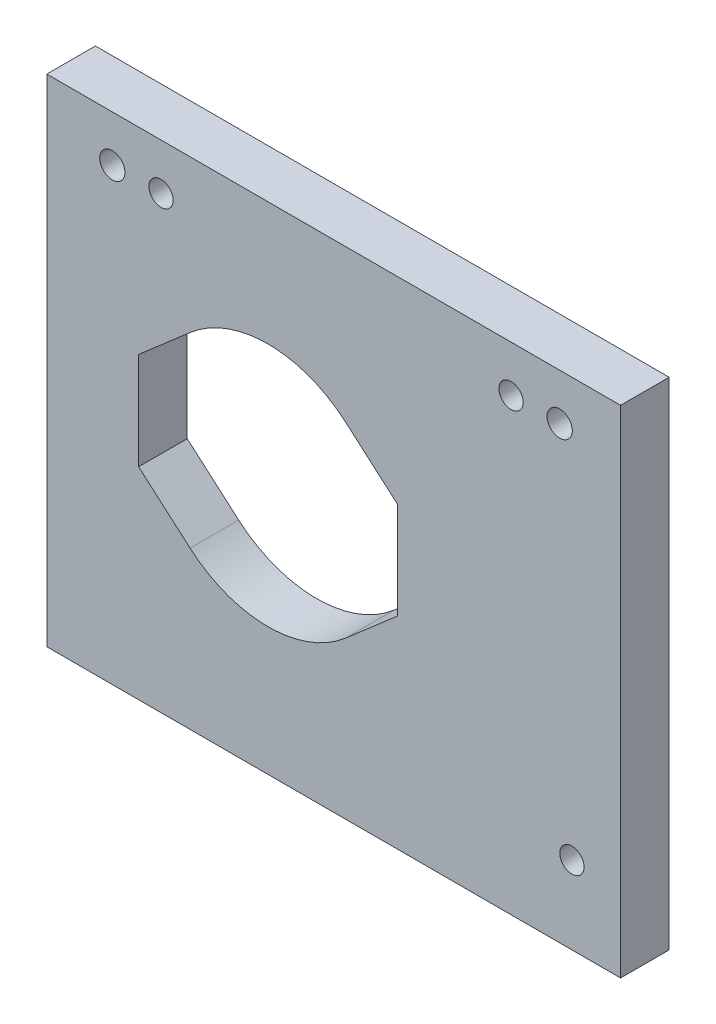
ISO-10303-21;
HEADER;
FILE_DESCRIPTION(('STEP AP214'),'2;1');
FILE_NAME('part.step','',(''),(''),'','','');
FILE_SCHEMA(('AUTOMOTIVE_DESIGN { 1 0 10303 214 1 1 1 1 }'));
ENDSEC;
DATA;
#1=APPLICATION_CONTEXT('core data for automotive mechanical design processes');
#2=APPLICATION_PROTOCOL_DEFINITION('international standard','automotive_design',2000,#1);
#3=PRODUCT_CONTEXT('',#1,'mechanical');
#4=PRODUCT('Part','Part','',(#3));
#5=PRODUCT_RELATED_PRODUCT_CATEGORY('part','',(#4));
#6=PRODUCT_DEFINITION_FORMATION('','',#4);
#7=PRODUCT_DEFINITION_CONTEXT('part definition',#1,'design');
#8=PRODUCT_DEFINITION('design','',#6,#7);
#9=PRODUCT_DEFINITION_SHAPE('','',#8);
#10=(LENGTH_UNIT() NAMED_UNIT(*) SI_UNIT(.MILLI.,.METRE.));
#11=(NAMED_UNIT(*) PLANE_ANGLE_UNIT() SI_UNIT($,.RADIAN.));
#12=(NAMED_UNIT(*) SI_UNIT($,.STERADIAN.) SOLID_ANGLE_UNIT());
#13=UNCERTAINTY_MEASURE_WITH_UNIT(LENGTH_MEASURE(1.E-05),#10,'distance_accuracy_value','');
#14=(GEOMETRIC_REPRESENTATION_CONTEXT(3) GLOBAL_UNCERTAINTY_ASSIGNED_CONTEXT((#13)) GLOBAL_UNIT_ASSIGNED_CONTEXT((#10,
#11,#12)) REPRESENTATION_CONTEXT('',''));
#15=CARTESIAN_POINT('',(0.,0.,0.));
#16=DIRECTION('',(0.,0.,1.));
#17=DIRECTION('',(1.,0.,0.));
#18=AXIS2_PLACEMENT_3D('',#15,#16,#17);
#19=CARTESIAN_POINT('',(-29.7388630515195,0.,5.));
#20=DIRECTION('',(-1.,0.,0.));
#21=DIRECTION('',(0.,-1.,0.));
#22=AXIS2_PLACEMENT_3D('',#19,#20,#21);
#23=PLANE('',#22);
#24=DIRECTION('',(0.,1.,0.));
#25=VECTOR('',#24,1.);
#26=CARTESIAN_POINT('',(-29.7388630515195,0.,0.));
#27=LINE('',#26,#25);
#28=CARTESIAN_POINT('',(-29.7388630515195,-25.7476076649813,0.));
#29=VERTEX_POINT('',#28);
#30=CARTESIAN_POINT('',(-29.7388630515195,25.2523923350187,0.));
#31=VERTEX_POINT('',#30);
#32=EDGE_CURVE('E195',#29,#31,#27,.T.);
#33=ORIENTED_EDGE('',*,*,#32,.F.);
#34=DIRECTION('',(0.,0.,-1.));
#35=VECTOR('',#34,1.);
#36=CARTESIAN_POINT('',(-29.7388630515195,-25.7476076649813,5.));
#37=LINE('',#36,#35);
#38=CARTESIAN_POINT('',(-29.7388630515195,-25.7476076649813,5.));
#39=VERTEX_POINT('',#38);
#40=EDGE_CURVE('E11',#39,#29,#37,.T.);
#41=ORIENTED_EDGE('',*,*,#40,.F.);
#42=DIRECTION('',(0.,1.,0.));
#43=VECTOR('',#42,1.);
#44=CARTESIAN_POINT('',(-29.7388630515195,0.,5.));
#45=LINE('',#44,#43);
#46=CARTESIAN_POINT('',(-29.7388630515195,25.2523923350187,5.));
#47=VERTEX_POINT('',#46);
#48=EDGE_CURVE('E150',#39,#47,#45,.T.);
#49=ORIENTED_EDGE('',*,*,#48,.T.);
#50=DIRECTION('',(0.,0.,-1.));
#51=VECTOR('',#50,1.);
#52=CARTESIAN_POINT('',(-29.7388630515195,25.2523923350187,5.));
#53=LINE('',#52,#51);
#54=EDGE_CURVE('E54',#47,#31,#53,.T.);
#55=ORIENTED_EDGE('',*,*,#54,.T.);
#56=EDGE_LOOP('',(#33,#41,#49,#55));
#57=FACE_BOUND('',#56,.T.);
#58=ADVANCED_FACE('F35',(#57),#23,.T.);
#59=CARTESIAN_POINT('',(0.,-25.7476076649813,5.));
#60=DIRECTION('',(0.,-1.,0.));
#61=DIRECTION('',(0.,0.,-1.));
#62=AXIS2_PLACEMENT_3D('',#59,#60,#61);
#63=PLANE('',#62);
#64=DIRECTION('',(-1.,0.,0.));
#65=VECTOR('',#64,1.);
#66=CARTESIAN_POINT('',(0.,-25.7476076649813,0.));
#67=LINE('',#66,#65);
#68=CARTESIAN_POINT('',(29.2611369484805,-25.7476076649813,0.));
#69=VERTEX_POINT('',#68);
#70=EDGE_CURVE('E138',#69,#29,#67,.T.);
#71=ORIENTED_EDGE('',*,*,#70,.F.);
#72=DIRECTION('',(0.,0.,-1.));
#73=VECTOR('',#72,1.);
#74=CARTESIAN_POINT('',(29.2611369484805,-25.7476076649813,5.));
#75=LINE('',#74,#73);
#76=CARTESIAN_POINT('',(29.2611369484805,-25.7476076649813,5.));
#77=VERTEX_POINT('',#76);
#78=EDGE_CURVE('E45',#77,#69,#75,.T.);
#79=ORIENTED_EDGE('',*,*,#78,.F.);
#80=DIRECTION('',(-1.,0.,0.));
#81=VECTOR('',#80,1.);
#82=CARTESIAN_POINT('',(0.,-25.7476076649813,5.));
#83=LINE('',#82,#81);
#84=EDGE_CURVE('E136',#77,#39,#83,.T.);
#85=ORIENTED_EDGE('',*,*,#84,.T.);
#86=ORIENTED_EDGE('',*,*,#40,.T.);
#87=EDGE_LOOP('',(#71,#79,#85,#86));
#88=FACE_BOUND('',#87,.T.);
#89=ADVANCED_FACE('F134',(#88),#63,.T.);
#90=CARTESIAN_POINT('',(29.2611369484805,0.,5.));
#91=DIRECTION('',(-1.,0.,0.));
#92=DIRECTION('',(0.,-1.,0.));
#93=AXIS2_PLACEMENT_3D('',#90,#91,#92);
#94=PLANE('',#93);
#95=DIRECTION('',(0.,1.,0.));
#96=VECTOR('',#95,1.);
#97=CARTESIAN_POINT('',(29.2611369484805,0.,0.));
#98=LINE('',#97,#96);
#99=CARTESIAN_POINT('',(29.2611369484805,25.2523923350187,0.));
#100=VERTEX_POINT('',#99);
#101=EDGE_CURVE('E198',#69,#100,#98,.T.);
#102=ORIENTED_EDGE('',*,*,#101,.T.);
#103=DIRECTION('',(0.,0.,-1.));
#104=VECTOR('',#103,1.);
#105=CARTESIAN_POINT('',(29.2611369484805,25.2523923350187,5.));
#106=LINE('',#105,#104);
#107=CARTESIAN_POINT('',(29.2611369484805,25.2523923350187,5.));
#108=VERTEX_POINT('',#107);
#109=EDGE_CURVE('E92',#108,#100,#106,.T.);
#110=ORIENTED_EDGE('',*,*,#109,.F.);
#111=DIRECTION('',(0.,1.,0.));
#112=VECTOR('',#111,1.);
#113=CARTESIAN_POINT('',(29.2611369484805,0.,5.));
#114=LINE('',#113,#112);
#115=EDGE_CURVE('E142',#77,#108,#114,.T.);
#116=ORIENTED_EDGE('',*,*,#115,.F.);
#117=ORIENTED_EDGE('',*,*,#78,.T.);
#118=EDGE_LOOP('',(#102,#110,#116,#117));
#119=FACE_BOUND('',#118,.T.);
#120=ADVANCED_FACE('F143',(#119),#94,.F.);
#121=CARTESIAN_POINT('',(-11.2080050635445,12.8996694796284,5.));
#122=DIRECTION('',(-0.655875469313451,0.754869107033041,0.));
#123=DIRECTION('',(-0.754869107033041,-0.655875469313451,0.));
#124=AXIS2_PLACEMENT_3D('',#121,#122,#123);
#125=PLANE('',#124);
#126=DIRECTION('',(0.754869107033041,0.655875469313451,0.));
#127=VECTOR('',#126,1.);
#128=CARTESIAN_POINT('',(-11.2080050635445,12.8996694796284,0.));
#129=LINE('',#128,#127);
#130=CARTESIAN_POINT('',(-20.3,5.,0.));
#131=VERTEX_POINT('',#130);
#132=CARTESIAN_POINT('',(-15.0076845762004,9.59828045683609,0.));
#133=VERTEX_POINT('',#132);
#134=EDGE_CURVE('E173',#131,#133,#129,.T.);
#135=ORIENTED_EDGE('',*,*,#134,.T.);
#136=DIRECTION('',(0.,0.,-1.));
#137=VECTOR('',#136,1.);
#138=CARTESIAN_POINT('',(-15.0076845762004,9.59828045683609,5.));
#139=LINE('',#138,#137);
#140=CARTESIAN_POINT('',(-15.0076845762004,9.59828045683609,5.));
#141=VERTEX_POINT('',#140);
#142=EDGE_CURVE('E39',#141,#133,#139,.T.);
#143=ORIENTED_EDGE('',*,*,#142,.F.);
#144=DIRECTION('',(0.754869107033041,0.655875469313451,0.));
#145=VECTOR('',#144,1.);
#146=CARTESIAN_POINT('',(-11.2080050635445,12.8996694796284,5.));
#147=LINE('',#146,#145);
#148=CARTESIAN_POINT('',(-20.3,5.,5.));
#149=VERTEX_POINT('',#148);
#150=EDGE_CURVE('E265',#149,#141,#147,.T.);
#151=ORIENTED_EDGE('',*,*,#150,.F.);
#152=DIRECTION('',(0.,0.,-1.));
#153=VECTOR('',#152,1.);
#154=CARTESIAN_POINT('',(-20.3,5.,5.));
#155=LINE('',#154,#153);
#156=EDGE_CURVE('E157',#149,#131,#155,.T.);
#157=ORIENTED_EDGE('',*,*,#156,.T.);
#158=EDGE_LOOP('',(#135,#143,#151,#157));
#159=FACE_BOUND('',#158,.T.);
#160=ADVANCED_FACE('F227',(#159),#125,.F.);
#161=CARTESIAN_POINT('',(-7.,0.381967317748673,5.));
#162=DIRECTION('',(0.,0.,-1.));
#163=DIRECTION('',(-1.,0.,0.));
#164=AXIS2_PLACEMENT_3D('',#161,#162,#163);
#165=CYLINDRICAL_SURFACE('',#164,12.2091539489694);
#166=CARTESIAN_POINT('',(-7.,0.381967317748673,0.));
#167=DIRECTION('',(0.,0.,1.));
#168=DIRECTION('',(1.,0.,0.));
#169=AXIS2_PLACEMENT_3D('',#166,#167,#168);
#170=CIRCLE('',#169,12.2091539489694);
#171=CARTESIAN_POINT('',(1.00768457620044,9.59828045683609,0.));
#172=VERTEX_POINT('',#171);
#173=EDGE_CURVE('E176',#133,#172,#170,.F.);
#174=ORIENTED_EDGE('',*,*,#173,.T.);
#175=DIRECTION('',(0.,0.,-1.));
#176=VECTOR('',#175,1.);
#177=CARTESIAN_POINT('',(1.00768457620044,9.59828045683609,5.));
#178=LINE('',#177,#176);
#179=CARTESIAN_POINT('',(1.00768457620044,9.59828045683609,5.));
#180=VERTEX_POINT('',#179);
#181=EDGE_CURVE('E218',#180,#172,#178,.T.);
#182=ORIENTED_EDGE('',*,*,#181,.F.);
#183=CARTESIAN_POINT('',(-7.,0.381967317748673,5.));
#184=DIRECTION('',(0.,0.,1.));
#185=DIRECTION('',(1.,0.,0.));
#186=AXIS2_PLACEMENT_3D('',#183,#184,#185);
#187=CIRCLE('',#186,12.2091539489694);
#188=EDGE_CURVE('E105',#141,#180,#187,.F.);
#189=ORIENTED_EDGE('',*,*,#188,.F.);
#190=ORIENTED_EDGE('',*,*,#142,.T.);
#191=EDGE_LOOP('',(#174,#182,#189,#190));
#192=FACE_BOUND('',#191,.T.);
#193=ADVANCED_FACE('F223',(#192),#165,.F.);
#194=CARTESIAN_POINT('',(5.18558822608458,5.96826766179108,5.));
#195=DIRECTION('',(-0.655875469313451,-0.754869107033041,0.));
#196=DIRECTION('',(0.754869107033041,-0.655875469313451,0.));
#197=AXIS2_PLACEMENT_3D('',#194,#195,#196);
#198=PLANE('',#197);
#199=DIRECTION('',(-0.754869107033041,0.655875469313451,0.));
#200=VECTOR('',#199,1.);
#201=CARTESIAN_POINT('',(5.18558822608458,5.96826766179108,0.));
#202=LINE('',#201,#200);
#203=CARTESIAN_POINT('',(6.3,5.,0.));
#204=VERTEX_POINT('',#203);
#205=EDGE_CURVE('E179',#204,#172,#202,.T.);
#206=ORIENTED_EDGE('',*,*,#205,.F.);
#207=DIRECTION('',(0.,0.,-1.));
#208=VECTOR('',#207,1.);
#209=CARTESIAN_POINT('',(6.3,5.,5.));
#210=LINE('',#209,#208);
#211=CARTESIAN_POINT('',(6.3,5.,5.));
#212=VERTEX_POINT('',#211);
#213=EDGE_CURVE('E217',#212,#204,#210,.T.);
#214=ORIENTED_EDGE('',*,*,#213,.F.);
#215=DIRECTION('',(-0.754869107033041,0.655875469313451,0.));
#216=VECTOR('',#215,1.);
#217=CARTESIAN_POINT('',(5.18558822608458,5.96826766179108,5.));
#218=LINE('',#217,#216);
#219=EDGE_CURVE('E261',#212,#180,#218,.T.);
#220=ORIENTED_EDGE('',*,*,#219,.T.);
#221=ORIENTED_EDGE('',*,*,#181,.T.);
#222=EDGE_LOOP('',(#206,#214,#220,#221));
#223=FACE_BOUND('',#222,.T.);
#224=ADVANCED_FACE('F260',(#223),#198,.T.);
#225=CARTESIAN_POINT('',(6.3,0.,5.));
#226=DIRECTION('',(1.,0.,0.));
#227=DIRECTION('',(0.,0.,-1.));
#228=AXIS2_PLACEMENT_3D('',#225,#226,#227);
#229=PLANE('',#228);
#230=DIRECTION('',(0.,-1.,0.));
#231=VECTOR('',#230,1.);
#232=CARTESIAN_POINT('',(6.3,0.,0.));
#233=LINE('',#232,#231);
#234=CARTESIAN_POINT('',(6.3,-5.,0.));
#235=VERTEX_POINT('',#234);
#236=EDGE_CURVE('E182',#204,#235,#233,.T.);
#237=ORIENTED_EDGE('',*,*,#236,.T.);
#238=DIRECTION('',(0.,0.,-1.));
#239=VECTOR('',#238,1.);
#240=CARTESIAN_POINT('',(6.3,-5.,5.));
#241=LINE('',#240,#239);
#242=CARTESIAN_POINT('',(6.3,-5.,5.));
#243=VERTEX_POINT('',#242);
#244=EDGE_CURVE('E214',#243,#235,#241,.T.);
#245=ORIENTED_EDGE('',*,*,#244,.F.);
#246=DIRECTION('',(0.,-1.,0.));
#247=VECTOR('',#246,1.);
#248=CARTESIAN_POINT('',(6.3,0.,5.));
#249=LINE('',#248,#247);
#250=EDGE_CURVE('E258',#212,#243,#249,.T.);
#251=ORIENTED_EDGE('',*,*,#250,.F.);
#252=ORIENTED_EDGE('',*,*,#213,.T.);
#253=EDGE_LOOP('',(#237,#245,#251,#252));
#254=FACE_BOUND('',#253,.T.);
#255=ADVANCED_FACE('F257',(#254),#229,.F.);
#256=CARTESIAN_POINT('',(5.18558822608458,-5.96826766179109,5.));
#257=DIRECTION('',(0.655875469313451,-0.754869107033041,0.));
#258=DIRECTION('',(0.754869107033041,0.655875469313451,0.));
#259=AXIS2_PLACEMENT_3D('',#256,#257,#258);
#260=PLANE('',#259);
#261=DIRECTION('',(-0.754869107033041,-0.655875469313451,0.));
#262=VECTOR('',#261,1.);
#263=CARTESIAN_POINT('',(5.18558822608458,-5.96826766179109,0.));
#264=LINE('',#263,#262);
#265=CARTESIAN_POINT('',(1.00768457620044,-9.59828045683609,0.));
#266=VERTEX_POINT('',#265);
#267=EDGE_CURVE('E184',#235,#266,#264,.T.);
#268=ORIENTED_EDGE('',*,*,#267,.T.);
#269=DIRECTION('',(0.,0.,-1.));
#270=VECTOR('',#269,1.);
#271=CARTESIAN_POINT('',(1.00768457620044,-9.59828045683609,5.));
#272=LINE('',#271,#270);
#273=CARTESIAN_POINT('',(1.00768457620044,-9.59828045683609,5.));
#274=VERTEX_POINT('',#273);
#275=EDGE_CURVE('E211',#274,#266,#272,.T.);
#276=ORIENTED_EDGE('',*,*,#275,.F.);
#277=DIRECTION('',(-0.754869107033041,-0.655875469313451,0.));
#278=VECTOR('',#277,1.);
#279=CARTESIAN_POINT('',(5.18558822608458,-5.96826766179109,5.));
#280=LINE('',#279,#278);
#281=EDGE_CURVE('E253',#243,#274,#280,.T.);
#282=ORIENTED_EDGE('',*,*,#281,.F.);
#283=ORIENTED_EDGE('',*,*,#244,.T.);
#284=EDGE_LOOP('',(#268,#276,#282,#283));
#285=FACE_BOUND('',#284,.T.);
#286=ADVANCED_FACE('F252',(#285),#260,.F.);
#287=CARTESIAN_POINT('',(-7.,-0.381967317748668,5.));
#288=DIRECTION('',(0.,0.,-1.));
#289=DIRECTION('',(-1.,0.,0.));
#290=AXIS2_PLACEMENT_3D('',#287,#288,#289);
#291=CYLINDRICAL_SURFACE('',#290,12.2091539489694);
#292=CARTESIAN_POINT('',(-7.,-0.381967317748668,0.));
#293=DIRECTION('',(0.,0.,1.));
#294=DIRECTION('',(1.,0.,0.));
#295=AXIS2_PLACEMENT_3D('',#292,#293,#294);
#296=CIRCLE('',#295,12.2091539489694);
#297=CARTESIAN_POINT('',(-15.0076845762004,-9.59828045683609,0.));
#298=VERTEX_POINT('',#297);
#299=EDGE_CURVE('E186',#266,#298,#296,.F.);
#300=ORIENTED_EDGE('',*,*,#299,.T.);
#301=DIRECTION('',(0.,0.,-1.));
#302=VECTOR('',#301,1.);
#303=CARTESIAN_POINT('',(-15.0076845762004,-9.59828045683609,5.));
#304=LINE('',#303,#302);
#305=CARTESIAN_POINT('',(-15.0076845762004,-9.59828045683609,5.));
#306=VERTEX_POINT('',#305);
#307=EDGE_CURVE('E209',#306,#298,#304,.T.);
#308=ORIENTED_EDGE('',*,*,#307,.F.);
#309=CARTESIAN_POINT('',(-7.,-0.381967317748668,5.));
#310=DIRECTION('',(0.,0.,1.));
#311=DIRECTION('',(1.,0.,0.));
#312=AXIS2_PLACEMENT_3D('',#309,#310,#311);
#313=CIRCLE('',#312,12.2091539489694);
#314=EDGE_CURVE('E249',#274,#306,#313,.F.);
#315=ORIENTED_EDGE('',*,*,#314,.F.);
#316=ORIENTED_EDGE('',*,*,#275,.T.);
#317=EDGE_LOOP('',(#300,#308,#315,#316));
#318=FACE_BOUND('',#317,.T.);
#319=ADVANCED_FACE('F246',(#318),#291,.F.);
#320=CARTESIAN_POINT('',(-11.2080050635445,-12.8996694796284,5.));
#321=DIRECTION('',(0.655875469313451,0.754869107033041,0.));
#322=DIRECTION('',(-0.754869107033041,0.655875469313451,0.));
#323=AXIS2_PLACEMENT_3D('',#320,#321,#322);
#324=PLANE('',#323);
#325=DIRECTION('',(0.754869107033041,-0.655875469313451,0.));
#326=VECTOR('',#325,1.);
#327=CARTESIAN_POINT('',(-11.2080050635445,-12.8996694796284,0.));
#328=LINE('',#327,#326);
#329=CARTESIAN_POINT('',(-20.3,-5.,0.));
#330=VERTEX_POINT('',#329);
#331=EDGE_CURVE('E189',#330,#298,#328,.T.);
#332=ORIENTED_EDGE('',*,*,#331,.F.);
#333=DIRECTION('',(0.,0.,-1.));
#334=VECTOR('',#333,1.);
#335=CARTESIAN_POINT('',(-20.3,-5.,5.));
#336=LINE('',#335,#334);
#337=CARTESIAN_POINT('',(-20.3,-5.,5.));
#338=VERTEX_POINT('',#337);
#339=EDGE_CURVE('E207',#338,#330,#336,.T.);
#340=ORIENTED_EDGE('',*,*,#339,.F.);
#341=DIRECTION('',(0.754869107033041,-0.655875469313451,0.));
#342=VECTOR('',#341,1.);
#343=CARTESIAN_POINT('',(-11.2080050635445,-12.8996694796284,5.));
#344=LINE('',#343,#342);
#345=EDGE_CURVE('E271',#338,#306,#344,.T.);
#346=ORIENTED_EDGE('',*,*,#345,.T.);
#347=ORIENTED_EDGE('',*,*,#307,.T.);
#348=EDGE_LOOP('',(#332,#340,#346,#347));
#349=FACE_BOUND('',#348,.T.);
#350=ADVANCED_FACE('F240',(#349),#324,.T.);
#351=CARTESIAN_POINT('',(-20.3,0.,5.));
#352=DIRECTION('',(1.,0.,0.));
#353=DIRECTION('',(0.,0.,-1.));
#354=AXIS2_PLACEMENT_3D('',#351,#352,#353);
#355=PLANE('',#354);
#356=DIRECTION('',(0.,-1.,0.));
#357=VECTOR('',#356,1.);
#358=CARTESIAN_POINT('',(-20.3,0.,0.));
#359=LINE('',#358,#357);
#360=EDGE_CURVE('E192',#131,#330,#359,.T.);
#361=ORIENTED_EDGE('',*,*,#360,.F.);
#362=ORIENTED_EDGE('',*,*,#156,.F.);
#363=DIRECTION('',(0.,-1.,0.));
#364=VECTOR('',#363,1.);
#365=CARTESIAN_POINT('',(-20.3,0.,5.));
#366=LINE('',#365,#364);
#367=EDGE_CURVE('E152',#149,#338,#366,.T.);
#368=ORIENTED_EDGE('',*,*,#367,.T.);
#369=ORIENTED_EDGE('',*,*,#339,.T.);
#370=EDGE_LOOP('',(#361,#362,#368,#369));
#371=FACE_BOUND('',#370,.T.);
#372=ADVANCED_FACE('F233',(#371),#355,.T.);
#373=CARTESIAN_POINT('',(24.2611369484805,-17.7476076649813,5.));
#374=DIRECTION('',(0.,0.,-1.));
#375=DIRECTION('',(-1.,0.,0.));
#376=AXIS2_PLACEMENT_3D('',#373,#374,#375);
#377=CYLINDRICAL_SURFACE('',#376,1.25);
#378=CARTESIAN_POINT('',(24.2611369484805,-17.7476076649813,5.));
#379=DIRECTION('',(0.,0.,1.));
#380=DIRECTION('',(1.,0.,0.));
#381=AXIS2_PLACEMENT_3D('',#378,#379,#380);
#382=CIRCLE('',#381,1.25);
#383=CARTESIAN_POINT('',(25.5111369484805,-17.7476076649813,5.));
#384=VERTEX_POINT('',#383);
#385=EDGE_CURVE('E272',#384,#384,#382,.T.);
#386=ORIENTED_EDGE('',*,*,#385,.T.);
#387=EDGE_LOOP('',(#386));
#388=FACE_BOUND('',#387,.T.);
#389=CARTESIAN_POINT('',(24.2611369484805,-17.7476076649813,0.));
#390=DIRECTION('',(0.,0.,1.));
#391=DIRECTION('',(1.,0.,0.));
#392=AXIS2_PLACEMENT_3D('',#389,#390,#391);
#393=CIRCLE('',#392,1.25);
#394=CARTESIAN_POINT('',(25.5111369484805,-17.7476076649813,0.));
#395=VERTEX_POINT('',#394);
#396=EDGE_CURVE('E170',#395,#395,#393,.T.);
#397=ORIENTED_EDGE('',*,*,#396,.F.);
#398=EDGE_LOOP('',(#397));
#399=FACE_BOUND('',#398,.T.);
#400=ADVANCED_FACE('F302',(#388,#399),#377,.F.);
#401=CARTESIAN_POINT('',(-23.,20.5,5.));
#402=DIRECTION('',(0.,0.,-1.));
#403=DIRECTION('',(-1.,0.,0.));
#404=AXIS2_PLACEMENT_3D('',#401,#402,#403);
#405=CYLINDRICAL_SURFACE('',#404,1.3);
#406=CARTESIAN_POINT('',(-23.,20.5,5.));
#407=DIRECTION('',(0.,0.,1.));
#408=DIRECTION('',(1.,0.,0.));
#409=AXIS2_PLACEMENT_3D('',#406,#407,#408);
#410=CIRCLE('',#409,1.3);
#411=CARTESIAN_POINT('',(-21.7,20.5,5.));
#412=VERTEX_POINT('',#411);
#413=EDGE_CURVE('E274',#412,#412,#410,.T.);
#414=ORIENTED_EDGE('',*,*,#413,.T.);
#415=EDGE_LOOP('',(#414));
#416=FACE_BOUND('',#415,.T.);
#417=CARTESIAN_POINT('',(-23.,20.5,0.));
#418=DIRECTION('',(0.,0.,1.));
#419=DIRECTION('',(1.,0.,0.));
#420=AXIS2_PLACEMENT_3D('',#417,#418,#419);
#421=CIRCLE('',#420,1.3);
#422=CARTESIAN_POINT('',(-21.7,20.5,0.));
#423=VERTEX_POINT('',#422);
#424=EDGE_CURVE('E167',#423,#423,#421,.T.);
#425=ORIENTED_EDGE('',*,*,#424,.F.);
#426=EDGE_LOOP('',(#425));
#427=FACE_BOUND('',#426,.T.);
#428=ADVANCED_FACE('F305',(#416,#427),#405,.F.);
#429=CARTESIAN_POINT('',(-18.,20.5,5.));
#430=DIRECTION('',(0.,0.,-1.));
#431=DIRECTION('',(-1.,0.,0.));
#432=AXIS2_PLACEMENT_3D('',#429,#430,#431);
#433=CYLINDRICAL_SURFACE('',#432,1.25);
#434=CARTESIAN_POINT('',(-18.,20.5,5.));
#435=DIRECTION('',(0.,0.,1.));
#436=DIRECTION('',(1.,0.,0.));
#437=AXIS2_PLACEMENT_3D('',#434,#435,#436);
#438=CIRCLE('',#437,1.25);
#439=CARTESIAN_POINT('',(-16.75,20.5,5.));
#440=VERTEX_POINT('',#439);
#441=EDGE_CURVE('E279',#440,#440,#438,.T.);
#442=ORIENTED_EDGE('',*,*,#441,.T.);
#443=EDGE_LOOP('',(#442));
#444=FACE_BOUND('',#443,.T.);
#445=CARTESIAN_POINT('',(-18.,20.5,0.));
#446=DIRECTION('',(0.,0.,1.));
#447=DIRECTION('',(1.,0.,0.));
#448=AXIS2_PLACEMENT_3D('',#445,#446,#447);
#449=CIRCLE('',#448,1.25);
#450=CARTESIAN_POINT('',(-16.75,20.5,0.));
#451=VERTEX_POINT('',#450);
#452=EDGE_CURVE('E164',#451,#451,#449,.T.);
#453=ORIENTED_EDGE('',*,*,#452,.F.);
#454=EDGE_LOOP('',(#453));
#455=FACE_BOUND('',#454,.T.);
#456=ADVANCED_FACE('F342',(#444,#455),#433,.F.);
#457=CARTESIAN_POINT('',(18.,20.5,5.));
#458=DIRECTION('',(0.,0.,-1.));
#459=DIRECTION('',(-1.,0.,0.));
#460=AXIS2_PLACEMENT_3D('',#457,#458,#459);
#461=CYLINDRICAL_SURFACE('',#460,1.25);
#462=CARTESIAN_POINT('',(18.,20.5,5.));
#463=DIRECTION('',(0.,0.,1.));
#464=DIRECTION('',(1.,0.,0.));
#465=AXIS2_PLACEMENT_3D('',#462,#463,#464);
#466=CIRCLE('',#465,1.25);
#467=CARTESIAN_POINT('',(19.25,20.5,5.));
#468=VERTEX_POINT('',#467);
#469=EDGE_CURVE('E282',#468,#468,#466,.T.);
#470=ORIENTED_EDGE('',*,*,#469,.T.);
#471=EDGE_LOOP('',(#470));
#472=FACE_BOUND('',#471,.T.);
#473=CARTESIAN_POINT('',(18.,20.5,0.));
#474=DIRECTION('',(0.,0.,1.));
#475=DIRECTION('',(1.,0.,0.));
#476=AXIS2_PLACEMENT_3D('',#473,#474,#475);
#477=CIRCLE('',#476,1.25);
#478=CARTESIAN_POINT('',(19.25,20.5,0.));
#479=VERTEX_POINT('',#478);
#480=EDGE_CURVE('E161',#479,#479,#477,.T.);
#481=ORIENTED_EDGE('',*,*,#480,.F.);
#482=EDGE_LOOP('',(#481));
#483=FACE_BOUND('',#482,.T.);
#484=ADVANCED_FACE('F345',(#472,#483),#461,.F.);
#485=CARTESIAN_POINT('',(23.,20.5,5.));
#486=DIRECTION('',(0.,0.,-1.));
#487=DIRECTION('',(-1.,0.,0.));
#488=AXIS2_PLACEMENT_3D('',#485,#486,#487);
#489=CYLINDRICAL_SURFACE('',#488,1.3);
#490=CARTESIAN_POINT('',(23.,20.5,5.));
#491=DIRECTION('',(0.,0.,1.));
#492=DIRECTION('',(1.,0.,0.));
#493=AXIS2_PLACEMENT_3D('',#490,#491,#492);
#494=CIRCLE('',#493,1.3);
#495=CARTESIAN_POINT('',(24.3,20.5,5.));
#496=VERTEX_POINT('',#495);
#497=EDGE_CURVE('E203',#496,#496,#494,.T.);
#498=ORIENTED_EDGE('',*,*,#497,.T.);
#499=EDGE_LOOP('',(#498));
#500=FACE_BOUND('',#499,.T.);
#501=CARTESIAN_POINT('',(23.,20.5,0.));
#502=DIRECTION('',(0.,0.,1.));
#503=DIRECTION('',(1.,0.,0.));
#504=AXIS2_PLACEMENT_3D('',#501,#502,#503);
#505=CIRCLE('',#504,1.3);
#506=CARTESIAN_POINT('',(24.3,20.5,0.));
#507=VERTEX_POINT('',#506);
#508=EDGE_CURVE('E158',#507,#507,#505,.T.);
#509=ORIENTED_EDGE('',*,*,#508,.F.);
#510=EDGE_LOOP('',(#509));
#511=FACE_BOUND('',#510,.T.);
#512=ADVANCED_FACE('F37',(#500,#511),#489,.F.);
#513=CARTESIAN_POINT('',(0.,25.2523923350187,5.));
#514=DIRECTION('',(0.,1.,0.));
#515=DIRECTION('',(0.,0.,1.));
#516=AXIS2_PLACEMENT_3D('',#513,#514,#515);
#517=PLANE('',#516);
#518=DIRECTION('',(1.,0.,0.));
#519=VECTOR('',#518,1.);
#520=CARTESIAN_POINT('',(0.,25.2523923350187,0.));
#521=LINE('',#520,#519);
#522=EDGE_CURVE('E200',#31,#100,#521,.T.);
#523=ORIENTED_EDGE('',*,*,#522,.F.);
#524=ORIENTED_EDGE('',*,*,#54,.F.);
#525=DIRECTION('',(1.,0.,0.));
#526=VECTOR('',#525,1.);
#527=CARTESIAN_POINT('',(0.,25.2523923350187,5.));
#528=LINE('',#527,#526);
#529=EDGE_CURVE('E146',#47,#108,#528,.T.);
#530=ORIENTED_EDGE('',*,*,#529,.T.);
#531=ORIENTED_EDGE('',*,*,#109,.T.);
#532=EDGE_LOOP('',(#523,#524,#530,#531));
#533=FACE_BOUND('',#532,.T.);
#534=ADVANCED_FACE('F292',(#533),#517,.T.);
#535=CARTESIAN_POINT('',(0.,0.,5.));
#536=DIRECTION('',(0.,0.,1.));
#537=DIRECTION('',(1.,0.,0.));
#538=AXIS2_PLACEMENT_3D('',#535,#536,#537);
#539=PLANE('',#538);
#540=ORIENTED_EDGE('',*,*,#497,.F.);
#541=EDGE_LOOP('',(#540));
#542=FACE_BOUND('',#541,.T.);
#543=ORIENTED_EDGE('',*,*,#469,.F.);
#544=EDGE_LOOP('',(#543));
#545=FACE_BOUND('',#544,.T.);
#546=ORIENTED_EDGE('',*,*,#441,.F.);
#547=EDGE_LOOP('',(#546));
#548=FACE_BOUND('',#547,.T.);
#549=ORIENTED_EDGE('',*,*,#413,.F.);
#550=EDGE_LOOP('',(#549));
#551=FACE_BOUND('',#550,.T.);
#552=ORIENTED_EDGE('',*,*,#385,.F.);
#553=EDGE_LOOP('',(#552));
#554=FACE_BOUND('',#553,.T.);
#555=ORIENTED_EDGE('',*,*,#150,.T.);
#556=ORIENTED_EDGE('',*,*,#188,.T.);
#557=ORIENTED_EDGE('',*,*,#219,.F.);
#558=ORIENTED_EDGE('',*,*,#250,.T.);
#559=ORIENTED_EDGE('',*,*,#281,.T.);
#560=ORIENTED_EDGE('',*,*,#314,.T.);
#561=ORIENTED_EDGE('',*,*,#345,.F.);
#562=ORIENTED_EDGE('',*,*,#367,.F.);
#563=EDGE_LOOP('',(#555,#556,#557,#558,#559,#560,#561,#562));
#564=FACE_BOUND('',#563,.T.);
#565=ORIENTED_EDGE('',*,*,#48,.F.);
#566=ORIENTED_EDGE('',*,*,#84,.F.);
#567=ORIENTED_EDGE('',*,*,#115,.T.);
#568=ORIENTED_EDGE('',*,*,#529,.F.);
#569=EDGE_LOOP('',(#565,#566,#567,#568));
#570=FACE_BOUND('',#569,.T.);
#571=ADVANCED_FACE('F149',(#542,#545,#548,#551,#554,#564,#570),#539,.T.);
#572=CARTESIAN_POINT('',(0.,0.,0.));
#573=DIRECTION('',(0.,0.,1.));
#574=DIRECTION('',(1.,0.,0.));
#575=AXIS2_PLACEMENT_3D('',#572,#573,#574);
#576=PLANE('',#575);
#577=ORIENTED_EDGE('',*,*,#508,.T.);
#578=EDGE_LOOP('',(#577));
#579=FACE_BOUND('',#578,.T.);
#580=ORIENTED_EDGE('',*,*,#480,.T.);
#581=EDGE_LOOP('',(#580));
#582=FACE_BOUND('',#581,.T.);
#583=ORIENTED_EDGE('',*,*,#452,.T.);
#584=EDGE_LOOP('',(#583));
#585=FACE_BOUND('',#584,.T.);
#586=ORIENTED_EDGE('',*,*,#424,.T.);
#587=EDGE_LOOP('',(#586));
#588=FACE_BOUND('',#587,.T.);
#589=ORIENTED_EDGE('',*,*,#396,.T.);
#590=EDGE_LOOP('',(#589));
#591=FACE_BOUND('',#590,.T.);
#592=ORIENTED_EDGE('',*,*,#134,.F.);
#593=ORIENTED_EDGE('',*,*,#360,.T.);
#594=ORIENTED_EDGE('',*,*,#331,.T.);
#595=ORIENTED_EDGE('',*,*,#299,.F.);
#596=ORIENTED_EDGE('',*,*,#267,.F.);
#597=ORIENTED_EDGE('',*,*,#236,.F.);
#598=ORIENTED_EDGE('',*,*,#205,.T.);
#599=ORIENTED_EDGE('',*,*,#173,.F.);
#600=EDGE_LOOP('',(#592,#593,#594,#595,#596,#597,#598,#599));
#601=FACE_BOUND('',#600,.T.);
#602=ORIENTED_EDGE('',*,*,#32,.T.);
#603=ORIENTED_EDGE('',*,*,#522,.T.);
#604=ORIENTED_EDGE('',*,*,#101,.F.);
#605=ORIENTED_EDGE('',*,*,#70,.T.);
#606=EDGE_LOOP('',(#602,#603,#604,#605));
#607=FACE_BOUND('',#606,.T.);
#608=ADVANCED_FACE('F230',(#579,#582,#585,#588,#591,#601,#607),#576,.F.);
#609=CLOSED_SHELL('',(#58,#89,#120,#160,#193,#224,#255,#286,#319,#350,#372,#400,#428,#456,#484,
#512,#534,#571,#608));
#610=MANIFOLD_SOLID_BREP('B2',#609);
#611=ADVANCED_BREP_SHAPE_REPRESENTATION('',(#18,#610),#14);
#612=SHAPE_DEFINITION_REPRESENTATION(#9,#611);
ENDSEC;
END-ISO-10303-21;
